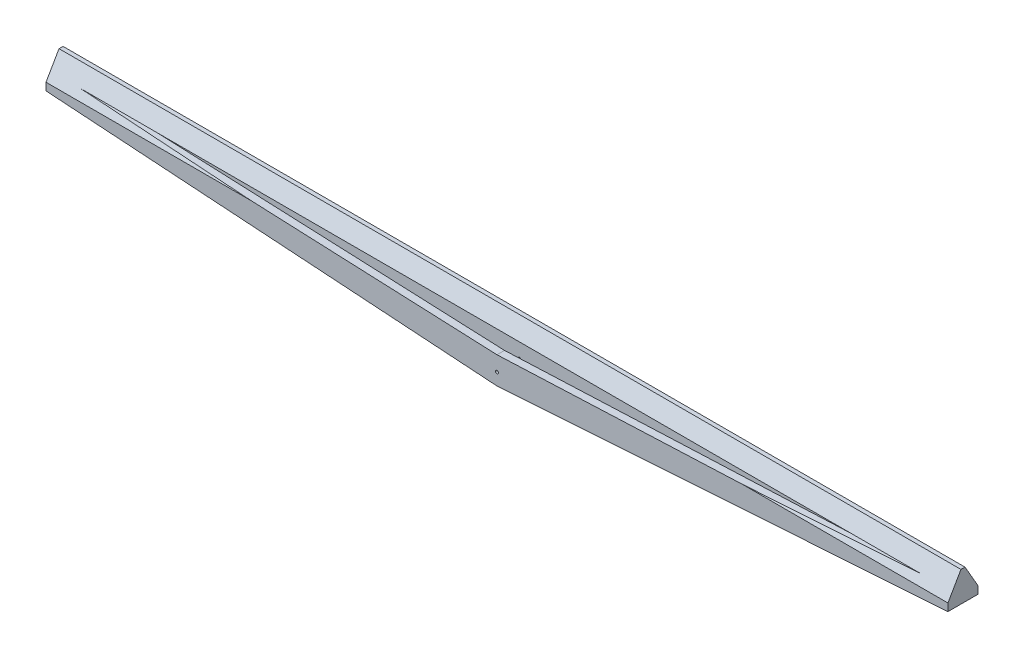
ISO-10303-21;
HEADER;
FILE_DESCRIPTION(('STEP AP214'),'2;1');
FILE_NAME('part.step','',(''),(''),'','','');
FILE_SCHEMA(('AUTOMOTIVE_DESIGN { 1 0 10303 214 1 1 1 1 }'));
ENDSEC;
DATA;
#1=APPLICATION_CONTEXT('core data for automotive mechanical design processes');
#2=APPLICATION_PROTOCOL_DEFINITION('international standard','automotive_design',2000,#1);
#3=PRODUCT_CONTEXT('',#1,'mechanical');
#4=PRODUCT('Part','Part','',(#3));
#5=PRODUCT_RELATED_PRODUCT_CATEGORY('part','',(#4));
#6=PRODUCT_DEFINITION_FORMATION('','',#4);
#7=PRODUCT_DEFINITION_CONTEXT('part definition',#1,'design');
#8=PRODUCT_DEFINITION('design','',#6,#7);
#9=PRODUCT_DEFINITION_SHAPE('','',#8);
#10=(LENGTH_UNIT() NAMED_UNIT(*) SI_UNIT(.MILLI.,.METRE.));
#11=(NAMED_UNIT(*) PLANE_ANGLE_UNIT() SI_UNIT($,.RADIAN.));
#12=(NAMED_UNIT(*) SI_UNIT($,.STERADIAN.) SOLID_ANGLE_UNIT());
#13=UNCERTAINTY_MEASURE_WITH_UNIT(LENGTH_MEASURE(1.E-05),#10,'distance_accuracy_value','');
#14=(GEOMETRIC_REPRESENTATION_CONTEXT(3) GLOBAL_UNCERTAINTY_ASSIGNED_CONTEXT((#13)) GLOBAL_UNIT_ASSIGNED_CONTEXT((#10,
#11,#12)) REPRESENTATION_CONTEXT('',''));
#15=CARTESIAN_POINT('',(0.,0.,0.));
#16=DIRECTION('',(0.,0.,1.));
#17=DIRECTION('',(1.,0.,0.));
#18=AXIS2_PLACEMENT_3D('',#15,#16,#17);
#19=CARTESIAN_POINT('',(300.,20.,20.));
#20=DIRECTION('',(-0.0665190105237739,0.997785157856609,0.));
#21=DIRECTION('',(-0.997785157856609,-0.0665190105237739,0.));
#22=AXIS2_PLACEMENT_3D('',#19,#20,#21);
#23=PLANE('',#22);
#24=DIRECTION('',(-0.997785157856609,-0.0665190105237739,0.));
#25=VECTOR('',#24,1.);
#26=CARTESIAN_POINT('',(300.,20.,15.));
#27=LINE('',#26,#25);
#28=CARTESIAN_POINT('',(250.,16.6666666666667,15.));
#29=VERTEX_POINT('',#28);
#30=CARTESIAN_POINT('',(0.,0.,15.));
#31=VERTEX_POINT('',#30);
#32=EDGE_CURVE('E175',#29,#31,#27,.T.);
#33=ORIENTED_EDGE('',*,*,#32,.F.);
#34=DIRECTION('',(0.,0.,1.));
#35=VECTOR('',#34,1.);
#36=CARTESIAN_POINT('',(250.,16.6666666666667,20.));
#37=LINE('',#36,#35);
#38=CARTESIAN_POINT('',(250.,16.6666666666667,5.00000000000001));
#39=VERTEX_POINT('',#38);
#40=EDGE_CURVE('E169',#39,#29,#37,.T.);
#41=ORIENTED_EDGE('',*,*,#40,.F.);
#42=DIRECTION('',(0.997785157856609,0.0665190105237739,0.));
#43=VECTOR('',#42,1.);
#44=CARTESIAN_POINT('',(300.,20.,5.00000000000001));
#45=LINE('',#44,#43);
#46=CARTESIAN_POINT('',(0.,0.,4.99999999999998));
#47=VERTEX_POINT('',#46);
#48=EDGE_CURVE('E157',#47,#39,#45,.T.);
#49=ORIENTED_EDGE('',*,*,#48,.F.);
#50=DIRECTION('',(0.,0.,-1.));
#51=VECTOR('',#50,1.);
#52=CARTESIAN_POINT('',(0.,0.,20.));
#53=LINE('',#52,#51);
#54=CARTESIAN_POINT('',(0.,0.,0.));
#55=VERTEX_POINT('',#54);
#56=EDGE_CURVE('E233',#47,#55,#53,.T.);
#57=ORIENTED_EDGE('',*,*,#56,.T.);
#58=DIRECTION('',(0.997785157856609,0.0665190105237739,0.));
#59=VECTOR('',#58,1.);
#60=CARTESIAN_POINT('',(300.,20.,0.));
#61=LINE('',#60,#59);
#62=CARTESIAN_POINT('',(300.,20.,0.));
#63=VERTEX_POINT('',#62);
#64=EDGE_CURVE('E212',#55,#63,#61,.T.);
#65=ORIENTED_EDGE('',*,*,#64,.T.);
#66=DIRECTION('',(0.,0.,-1.));
#67=VECTOR('',#66,1.);
#68=CARTESIAN_POINT('',(300.,20.,20.));
#69=LINE('',#68,#67);
#70=CARTESIAN_POINT('',(300.,20.,20.));
#71=VERTEX_POINT('',#70);
#72=EDGE_CURVE('E245',#71,#63,#69,.T.);
#73=ORIENTED_EDGE('',*,*,#72,.F.);
#74=DIRECTION('',(0.997785157856609,0.0665190105237739,0.));
#75=VECTOR('',#74,1.);
#76=CARTESIAN_POINT('',(300.,20.,20.));
#77=LINE('',#76,#75);
#78=CARTESIAN_POINT('',(0.,0.,20.));
#79=VERTEX_POINT('',#78);
#80=EDGE_CURVE('E223',#79,#71,#77,.T.);
#81=ORIENTED_EDGE('',*,*,#80,.F.);
#82=EDGE_CURVE('E234',#79,#31,#53,.T.);
#83=ORIENTED_EDGE('',*,*,#82,.T.);
#84=EDGE_LOOP('',(#33,#41,#49,#57,#65,#73,#81,#83));
#85=FACE_BOUND('',#84,.T.);
#86=ADVANCED_FACE('F33',(#85),#23,.F.);
#87=CARTESIAN_POINT('',(0.,0.,20.));
#88=DIRECTION('',(0.0665190105237739,0.997785157856609,0.));
#89=DIRECTION('',(-0.997785157856609,0.0665190105237739,0.));
#90=AXIS2_PLACEMENT_3D('',#87,#88,#89);
#91=PLANE('',#90);
#92=DIRECTION('',(-0.997785157856609,0.0665190105237739,0.));
#93=VECTOR('',#92,1.);
#94=CARTESIAN_POINT('',(0.,0.,15.));
#95=LINE('',#94,#93);
#96=CARTESIAN_POINT('',(-250.,16.6666666666667,14.9999999999999));
#97=VERTEX_POINT('',#96);
#98=EDGE_CURVE('E301',#31,#97,#95,.T.);
#99=ORIENTED_EDGE('',*,*,#98,.F.);
#100=ORIENTED_EDGE('',*,*,#82,.F.);
#101=DIRECTION('',(0.997785157856609,-0.0665190105237739,0.));
#102=VECTOR('',#101,1.);
#103=CARTESIAN_POINT('',(0.,0.,20.));
#104=LINE('',#103,#102);
#105=CARTESIAN_POINT('',(-300.,20.,20.));
#106=VERTEX_POINT('',#105);
#107=EDGE_CURVE('E231',#106,#79,#104,.T.);
#108=ORIENTED_EDGE('',*,*,#107,.F.);
#109=DIRECTION('',(0.,0.,-1.));
#110=VECTOR('',#109,1.);
#111=CARTESIAN_POINT('',(-300.,20.,20.));
#112=LINE('',#111,#110);
#113=CARTESIAN_POINT('',(-300.,20.,0.));
#114=VERTEX_POINT('',#113);
#115=EDGE_CURVE('E236',#106,#114,#112,.T.);
#116=ORIENTED_EDGE('',*,*,#115,.T.);
#117=DIRECTION('',(0.997785157856609,-0.0665190105237739,0.));
#118=VECTOR('',#117,1.);
#119=CARTESIAN_POINT('',(0.,0.,0.));
#120=LINE('',#119,#118);
#121=EDGE_CURVE('E220',#114,#55,#120,.T.);
#122=ORIENTED_EDGE('',*,*,#121,.T.);
#123=ORIENTED_EDGE('',*,*,#56,.F.);
#124=DIRECTION('',(0.997785157856609,-0.0665190105237739,0.));
#125=VECTOR('',#124,1.);
#126=CARTESIAN_POINT('',(0.,0.,4.99999999999998));
#127=LINE('',#126,#125);
#128=CARTESIAN_POINT('',(-250.,16.6666666666667,4.99999999999994));
#129=VERTEX_POINT('',#128);
#130=EDGE_CURVE('E163',#129,#47,#127,.T.);
#131=ORIENTED_EDGE('',*,*,#130,.F.);
#132=DIRECTION('',(0.,0.,-1.));
#133=VECTOR('',#132,1.);
#134=CARTESIAN_POINT('',(-250.,16.6666666666667,20.));
#135=LINE('',#134,#133);
#136=EDGE_CURVE('E179',#97,#129,#135,.T.);
#137=ORIENTED_EDGE('',*,*,#136,.F.);
#138=EDGE_LOOP('',(#99,#100,#108,#116,#122,#123,#131,#137));
#139=FACE_BOUND('',#138,.T.);
#140=ADVANCED_FACE('F307',(#139),#91,.F.);
#141=CARTESIAN_POINT('',(0.,18.,20.));
#142=DIRECTION('',(0.0428178383921859,0.99908289581767,0.));
#143=DIRECTION('',(-0.99908289581767,0.0428178383921859,0.));
#144=AXIS2_PLACEMENT_3D('',#141,#142,#143);
#145=PLANE('',#144);
#146=DIRECTION('',(0.,0.,-1.));
#147=VECTOR('',#146,1.);
#148=CARTESIAN_POINT('',(0.,18.,20.));
#149=LINE('',#148,#147);
#150=CARTESIAN_POINT('',(0.,18.,20.));
#151=VERTEX_POINT('',#150);
#152=CARTESIAN_POINT('',(0.,18.,15.));
#153=VERTEX_POINT('',#152);
#154=EDGE_CURVE('E209',#151,#153,#149,.T.);
#155=ORIENTED_EDGE('',*,*,#154,.T.);
#156=DIRECTION('',(-0.99908289581767,0.0428178383921859,0.));
#157=VECTOR('',#156,1.);
#158=CARTESIAN_POINT('',(0.,18.,15.));
#159=LINE('',#158,#157);
#160=CARTESIAN_POINT('',(-250.,28.7142857142857,14.9999999999999));
#161=VERTEX_POINT('',#160);
#162=EDGE_CURVE('E299',#153,#161,#159,.T.);
#163=ORIENTED_EDGE('',*,*,#162,.T.);
#164=DIRECTION('',(0.,0.,-1.));
#165=VECTOR('',#164,1.);
#166=CARTESIAN_POINT('',(-250.,28.7142857142857,20.));
#167=LINE('',#166,#165);
#168=CARTESIAN_POINT('',(-250.,28.7142857142857,4.99999999999994));
#169=VERTEX_POINT('',#168);
#170=EDGE_CURVE('E176',#161,#169,#167,.T.);
#171=ORIENTED_EDGE('',*,*,#170,.T.);
#172=DIRECTION('',(0.99908289581767,-0.0428178383921859,0.));
#173=VECTOR('',#172,1.);
#174=CARTESIAN_POINT('',(0.,18.,4.99999999999998));
#175=LINE('',#174,#173);
#176=CARTESIAN_POINT('',(0.,18.,4.99999999999998));
#177=VERTEX_POINT('',#176);
#178=EDGE_CURVE('E284',#169,#177,#175,.T.);
#179=ORIENTED_EDGE('',*,*,#178,.T.);
#180=CARTESIAN_POINT('',(0.,18.,0.));
#181=VERTEX_POINT('',#180);
#182=EDGE_CURVE('E208',#177,#181,#149,.T.);
#183=ORIENTED_EDGE('',*,*,#182,.T.);
#184=DIRECTION('',(0.99908289581767,-0.0428178383921859,0.));
#185=VECTOR('',#184,1.);
#186=CARTESIAN_POINT('',(0.,18.,0.));
#187=LINE('',#186,#185);
#188=CARTESIAN_POINT('',(-163.333333333332,24.9999999999999,0.));
#189=VERTEX_POINT('',#188);
#190=EDGE_CURVE('E191',#189,#181,#187,.T.);
#191=ORIENTED_EDGE('',*,*,#190,.F.);
#192=DIRECTION('',(-0.998777754686862,0.0428047609151512,0.0247133402369605));
#193=VECTOR('',#192,1.);
#194=CARTESIAN_POINT('',(-0.593418389779412,18.0254322167048,-4.02676858716678));
#195=LINE('',#194,#193);
#196=CARTESIAN_POINT('',(-280.,30.,2.8867513459482));
#197=VERTEX_POINT('',#196);
#198=EDGE_CURVE('E274',#189,#197,#195,.T.);
#199=ORIENTED_EDGE('',*,*,#198,.T.);
#200=DIRECTION('',(0.,0.,-1.));
#201=VECTOR('',#200,1.);
#202=CARTESIAN_POINT('',(-280.,30.,20.));
#203=LINE('',#202,#201);
#204=CARTESIAN_POINT('',(-280.,30.,17.1132486540518));
#205=VERTEX_POINT('',#204);
#206=EDGE_CURVE('E202',#205,#197,#203,.T.);
#207=ORIENTED_EDGE('',*,*,#206,.F.);
#208=DIRECTION('',(-0.998777754686862,0.0428047609151512,-0.0247133402369605));
#209=VECTOR('',#208,1.);
#210=CARTESIAN_POINT('',(-0.0997557003257349,18.0042752442997,24.0389835708801));
#211=LINE('',#210,#209);
#212=CARTESIAN_POINT('',(-163.333333333332,24.9999999999999,20.));
#213=VERTEX_POINT('',#212);
#214=EDGE_CURVE('E257',#205,#213,#211,.F.);
#215=ORIENTED_EDGE('',*,*,#214,.T.);
#216=DIRECTION('',(0.99908289581767,-0.0428178383921859,0.));
#217=VECTOR('',#216,1.);
#218=CARTESIAN_POINT('',(0.,18.,20.));
#219=LINE('',#218,#217);
#220=EDGE_CURVE('E197',#213,#151,#219,.T.);
#221=ORIENTED_EDGE('',*,*,#220,.T.);
#222=EDGE_LOOP('',(#155,#163,#171,#179,#183,#191,#199,#207,#215,#221));
#223=FACE_BOUND('',#222,.T.);
#224=ADVANCED_FACE('F343',(#223),#145,.T.);
#225=CARTESIAN_POINT('',(280.,30.,20.));
#226=DIRECTION('',(-0.0428178383921859,0.99908289581767,0.));
#227=DIRECTION('',(-0.99908289581767,-0.0428178383921859,0.));
#228=AXIS2_PLACEMENT_3D('',#225,#226,#227);
#229=PLANE('',#228);
#230=DIRECTION('',(0.,0.,1.));
#231=VECTOR('',#230,1.);
#232=CARTESIAN_POINT('',(250.,28.7142857142857,20.));
#233=LINE('',#232,#231);
#234=CARTESIAN_POINT('',(250.,28.7142857142857,5.00000000000001));
#235=VERTEX_POINT('',#234);
#236=CARTESIAN_POINT('',(250.,28.7142857142857,15.));
#237=VERTEX_POINT('',#236);
#238=EDGE_CURVE('E171',#235,#237,#233,.T.);
#239=ORIENTED_EDGE('',*,*,#238,.T.);
#240=DIRECTION('',(-0.99908289581767,-0.0428178383921859,0.));
#241=VECTOR('',#240,1.);
#242=CARTESIAN_POINT('',(280.,30.,15.));
#243=LINE('',#242,#241);
#244=EDGE_CURVE('E296',#237,#153,#243,.T.);
#245=ORIENTED_EDGE('',*,*,#244,.T.);
#246=ORIENTED_EDGE('',*,*,#154,.F.);
#247=DIRECTION('',(0.99908289581767,0.0428178383921859,0.));
#248=VECTOR('',#247,1.);
#249=CARTESIAN_POINT('',(280.,30.,20.));
#250=LINE('',#249,#248);
#251=CARTESIAN_POINT('',(163.333333333332,24.9999999999999,20.));
#252=VERTEX_POINT('',#251);
#253=EDGE_CURVE('E199',#151,#252,#250,.T.);
#254=ORIENTED_EDGE('',*,*,#253,.T.);
#255=DIRECTION('',(-0.998777754686862,-0.0428047609151512,0.0247133402369605));
#256=VECTOR('',#255,1.);
#257=CARTESIAN_POINT('',(279.928745928339,29.9969462540717,17.1150117350856));
#258=LINE('',#257,#256);
#259=CARTESIAN_POINT('',(280.,30.,17.1132486540518));
#260=VERTEX_POINT('',#259);
#261=EDGE_CURVE('E253',#252,#260,#258,.F.);
#262=ORIENTED_EDGE('',*,*,#261,.T.);
#263=DIRECTION('',(0.,0.,-1.));
#264=VECTOR('',#263,1.);
#265=CARTESIAN_POINT('',(280.,30.,20.));
#266=LINE('',#265,#264);
#267=CARTESIAN_POINT('',(280.,30.,2.8867513459482));
#268=VERTEX_POINT('',#267);
#269=EDGE_CURVE('E205',#260,#268,#266,.T.);
#270=ORIENTED_EDGE('',*,*,#269,.T.);
#271=DIRECTION('',(-0.998777754686862,-0.0428047609151512,-0.0247133402369605));
#272=VECTOR('',#271,1.);
#273=CARTESIAN_POINT('',(280.422408617792,30.0181032264768,2.8972032486278));
#274=LINE('',#273,#272);
#275=CARTESIAN_POINT('',(163.333333333333,25.,0.));
#276=VERTEX_POINT('',#275);
#277=EDGE_CURVE('E41',#268,#276,#274,.T.);
#278=ORIENTED_EDGE('',*,*,#277,.T.);
#279=DIRECTION('',(0.99908289581767,0.0428178383921859,0.));
#280=VECTOR('',#279,1.);
#281=CARTESIAN_POINT('',(280.,30.,0.));
#282=LINE('',#281,#280);
#283=EDGE_CURVE('E194',#181,#276,#282,.T.);
#284=ORIENTED_EDGE('',*,*,#283,.F.);
#285=ORIENTED_EDGE('',*,*,#182,.F.);
#286=DIRECTION('',(0.99908289581767,0.0428178383921859,0.));
#287=VECTOR('',#286,1.);
#288=CARTESIAN_POINT('',(280.,30.,5.00000000000001));
#289=LINE('',#288,#287);
#290=EDGE_CURVE('E280',#177,#235,#289,.T.);
#291=ORIENTED_EDGE('',*,*,#290,.T.);
#292=EDGE_LOOP('',(#239,#245,#246,#254,#262,#270,#278,#284,#285,#291));
#293=FACE_BOUND('',#292,.T.);
#294=ADVANCED_FACE('F340',(#293),#229,.T.);
#295=CARTESIAN_POINT('',(0.,8.,20.));
#296=DIRECTION('',(0.,0.,-1.));
#297=DIRECTION('',(-1.,0.,0.));
#298=AXIS2_PLACEMENT_3D('',#295,#296,#297);
#299=CYLINDRICAL_SURFACE('',#298,1.);
#300=CARTESIAN_POINT('',(0.,8.,20.));
#301=DIRECTION('',(0.,0.,1.));
#302=DIRECTION('',(1.,0.,0.));
#303=AXIS2_PLACEMENT_3D('',#300,#301,#302);
#304=CIRCLE('',#303,1.);
#305=CARTESIAN_POINT('',(1.,8.,20.));
#306=VERTEX_POINT('',#305);
#307=EDGE_CURVE('E188',#306,#306,#304,.T.);
#308=ORIENTED_EDGE('',*,*,#307,.T.);
#309=EDGE_LOOP('',(#308));
#310=FACE_BOUND('',#309,.T.);
#311=CARTESIAN_POINT('',(0.,8.,15.));
#312=DIRECTION('',(0.,0.,-1.));
#313=DIRECTION('',(-1.,0.,0.));
#314=AXIS2_PLACEMENT_3D('',#311,#312,#313);
#315=CIRCLE('',#314,1.);
#316=CARTESIAN_POINT('',(-1.,8.,15.));
#317=VERTEX_POINT('',#316);
#318=EDGE_CURVE('E36',#317,#317,#315,.T.);
#319=ORIENTED_EDGE('',*,*,#318,.T.);
#320=EDGE_LOOP('',(#319));
#321=FACE_BOUND('',#320,.T.);
#322=ADVANCED_FACE('F394',(#310,#321),#299,.F.);
#323=CARTESIAN_POINT('',(0.,8.,0.));
#324=DIRECTION('',(0.,0.,1.));
#325=DIRECTION('',(1.,0.,0.));
#326=AXIS2_PLACEMENT_3D('',#323,#324,#325);
#327=CIRCLE('',#326,1.);
#328=CARTESIAN_POINT('',(1.,8.,0.));
#329=VERTEX_POINT('',#328);
#330=EDGE_CURVE('E185',#329,#329,#327,.T.);
#331=ORIENTED_EDGE('',*,*,#330,.F.);
#332=EDGE_LOOP('',(#331));
#333=FACE_BOUND('',#332,.T.);
#334=CARTESIAN_POINT('',(0.,8.,4.99999999999998));
#335=DIRECTION('',(0.,0.,1.));
#336=DIRECTION('',(1.,0.,0.));
#337=AXIS2_PLACEMENT_3D('',#334,#335,#336);
#338=CIRCLE('',#337,1.);
#339=CARTESIAN_POINT('',(1.,8.,4.99999999999998));
#340=VERTEX_POINT('',#339);
#341=EDGE_CURVE('E278',#340,#340,#338,.T.);
#342=ORIENTED_EDGE('',*,*,#341,.T.);
#343=EDGE_LOOP('',(#342));
#344=FACE_BOUND('',#343,.T.);
#345=ADVANCED_FACE('F392',(#333,#344),#299,.F.);
#346=CARTESIAN_POINT('',(-300.,-20.,20.));
#347=DIRECTION('',(0.,0.,-1.));
#348=DIRECTION('',(-1.,0.,0.));
#349=AXIS2_PLACEMENT_3D('',#346,#347,#348);
#350=PLANE('',#349);
#351=DIRECTION('',(0.,1.,0.));
#352=VECTOR('',#351,1.);
#353=CARTESIAN_POINT('',(300.,40.,20.));
#354=LINE('',#353,#352);
#355=CARTESIAN_POINT('',(300.,24.9999999999999,20.));
#356=VERTEX_POINT('',#355);
#357=EDGE_CURVE('E226',#71,#356,#354,.T.);
#358=ORIENTED_EDGE('',*,*,#357,.T.);
#359=DIRECTION('',(-1.,0.,0.));
#360=VECTOR('',#359,1.);
#361=CARTESIAN_POINT('',(-300.,24.9999999999999,20.));
#362=LINE('',#361,#360);
#363=EDGE_CURVE('E250',#356,#252,#362,.T.);
#364=ORIENTED_EDGE('',*,*,#363,.T.);
#365=ORIENTED_EDGE('',*,*,#253,.F.);
#366=ORIENTED_EDGE('',*,*,#220,.F.);
#367=DIRECTION('',(-1.,0.,0.));
#368=VECTOR('',#367,1.);
#369=CARTESIAN_POINT('',(-300.,24.9999999999999,20.));
#370=LINE('',#369,#368);
#371=CARTESIAN_POINT('',(-300.,24.9999999999999,20.));
#372=VERTEX_POINT('',#371);
#373=EDGE_CURVE('E248',#213,#372,#370,.T.);
#374=ORIENTED_EDGE('',*,*,#373,.T.);
#375=DIRECTION('',(0.,-1.,0.));
#376=VECTOR('',#375,1.);
#377=CARTESIAN_POINT('',(-300.,20.,20.));
#378=LINE('',#377,#376);
#379=EDGE_CURVE('E229',#372,#106,#378,.T.);
#380=ORIENTED_EDGE('',*,*,#379,.T.);
#381=ORIENTED_EDGE('',*,*,#107,.T.);
#382=ORIENTED_EDGE('',*,*,#80,.T.);
#383=EDGE_LOOP('',(#358,#364,#365,#366,#374,#380,#381,#382));
#384=FACE_BOUND('',#383,.T.);
#385=ORIENTED_EDGE('',*,*,#307,.F.);
#386=EDGE_LOOP('',(#385));
#387=FACE_BOUND('',#386,.T.);
#388=ADVANCED_FACE('F312',(#384,#387),#350,.F.);
#389=CARTESIAN_POINT('',(-300.,-20.,0.));
#390=DIRECTION('',(0.,0.,-1.));
#391=DIRECTION('',(-1.,0.,0.));
#392=AXIS2_PLACEMENT_3D('',#389,#390,#391);
#393=PLANE('',#392);
#394=DIRECTION('',(0.,-1.,0.));
#395=VECTOR('',#394,1.);
#396=CARTESIAN_POINT('',(-300.,20.,0.));
#397=LINE('',#396,#395);
#398=CARTESIAN_POINT('',(-300.,24.9999999999999,0.));
#399=VERTEX_POINT('',#398);
#400=EDGE_CURVE('E218',#399,#114,#397,.T.);
#401=ORIENTED_EDGE('',*,*,#400,.F.);
#402=DIRECTION('',(1.,0.,0.));
#403=VECTOR('',#402,1.);
#404=CARTESIAN_POINT('',(300.,24.9999999999999,0.));
#405=LINE('',#404,#403);
#406=EDGE_CURVE('E272',#399,#189,#405,.T.);
#407=ORIENTED_EDGE('',*,*,#406,.T.);
#408=ORIENTED_EDGE('',*,*,#190,.T.);
#409=ORIENTED_EDGE('',*,*,#283,.T.);
#410=DIRECTION('',(1.,0.,0.));
#411=VECTOR('',#410,1.);
#412=CARTESIAN_POINT('',(300.,24.9999999999999,0.));
#413=LINE('',#412,#411);
#414=CARTESIAN_POINT('',(300.,24.9999999999999,0.));
#415=VERTEX_POINT('',#414);
#416=EDGE_CURVE('E270',#276,#415,#413,.T.);
#417=ORIENTED_EDGE('',*,*,#416,.T.);
#418=DIRECTION('',(0.,1.,0.));
#419=VECTOR('',#418,1.);
#420=CARTESIAN_POINT('',(300.,40.,0.));
#421=LINE('',#420,#419);
#422=EDGE_CURVE('E215',#63,#415,#421,.T.);
#423=ORIENTED_EDGE('',*,*,#422,.F.);
#424=ORIENTED_EDGE('',*,*,#64,.F.);
#425=ORIENTED_EDGE('',*,*,#121,.F.);
#426=EDGE_LOOP('',(#401,#407,#408,#409,#417,#423,#424,#425));
#427=FACE_BOUND('',#426,.T.);
#428=ORIENTED_EDGE('',*,*,#330,.T.);
#429=EDGE_LOOP('',(#428));
#430=FACE_BOUND('',#429,.T.);
#431=ADVANCED_FACE('F322',(#427,#430),#393,.T.);
#432=CARTESIAN_POINT('',(300.,40.,20.));
#433=DIRECTION('',(-1.,0.,0.));
#434=DIRECTION('',(0.,0.,1.));
#435=AXIS2_PLACEMENT_3D('',#432,#433,#434);
#436=PLANE('',#435);
#437=ORIENTED_EDGE('',*,*,#422,.T.);
#438=DIRECTION('',(0.,0.866025403784435,0.500000000000005));
#439=VECTOR('',#438,1.);
#440=CARTESIAN_POINT('',(300.,40.,8.66025403784455));
#441=LINE('',#440,#439);
#442=CARTESIAN_POINT('',(300.,40.,8.66025403784455));
#443=VERTEX_POINT('',#442);
#444=EDGE_CURVE('E11',#415,#443,#441,.T.);
#445=ORIENTED_EDGE('',*,*,#444,.T.);
#446=DIRECTION('',(0.,0.,-1.));
#447=VECTOR('',#446,1.);
#448=CARTESIAN_POINT('',(300.,40.,20.));
#449=LINE('',#448,#447);
#450=CARTESIAN_POINT('',(300.,40.,11.3397459621555));
#451=VERTEX_POINT('',#450);
#452=EDGE_CURVE('E242',#451,#443,#449,.T.);
#453=ORIENTED_EDGE('',*,*,#452,.F.);
#454=DIRECTION('',(0.,0.866025403784435,-0.500000000000005));
#455=VECTOR('',#454,1.);
#456=CARTESIAN_POINT('',(300.,24.9999999999999,20.));
#457=LINE('',#456,#455);
#458=EDGE_CURVE('E263',#451,#356,#457,.F.);
#459=ORIENTED_EDGE('',*,*,#458,.T.);
#460=ORIENTED_EDGE('',*,*,#357,.F.);
#461=ORIENTED_EDGE('',*,*,#72,.T.);
#462=EDGE_LOOP('',(#437,#445,#453,#459,#460,#461));
#463=FACE_BOUND('',#462,.T.);
#464=ADVANCED_FACE('F328',(#463),#436,.F.);
#465=CARTESIAN_POINT('',(-300.,40.,20.));
#466=DIRECTION('',(0.,-1.,0.));
#467=DIRECTION('',(0.,0.,-1.));
#468=AXIS2_PLACEMENT_3D('',#465,#466,#467);
#469=PLANE('',#468);
#470=ORIENTED_EDGE('',*,*,#452,.T.);
#471=DIRECTION('',(-1.,0.,0.));
#472=VECTOR('',#471,1.);
#473=CARTESIAN_POINT('',(-300.,40.,8.66025403784455));
#474=LINE('',#473,#472);
#475=CARTESIAN_POINT('',(-300.,40.,8.66025403784455));
#476=VERTEX_POINT('',#475);
#477=EDGE_CURVE('E265',#443,#476,#474,.T.);
#478=ORIENTED_EDGE('',*,*,#477,.T.);
#479=DIRECTION('',(0.,0.,-1.));
#480=VECTOR('',#479,1.);
#481=CARTESIAN_POINT('',(-300.,40.,20.));
#482=LINE('',#481,#480);
#483=CARTESIAN_POINT('',(-300.,40.,11.3397459621555));
#484=VERTEX_POINT('',#483);
#485=EDGE_CURVE('E239',#484,#476,#482,.T.);
#486=ORIENTED_EDGE('',*,*,#485,.F.);
#487=DIRECTION('',(1.,0.,0.));
#488=VECTOR('',#487,1.);
#489=CARTESIAN_POINT('',(-300.,40.,11.3397459621555));
#490=LINE('',#489,#488);
#491=EDGE_CURVE('E261',#484,#451,#490,.T.);
#492=ORIENTED_EDGE('',*,*,#491,.T.);
#493=EDGE_LOOP('',(#470,#478,#486,#492));
#494=FACE_BOUND('',#493,.T.);
#495=ADVANCED_FACE('F350',(#494),#469,.F.);
#496=CARTESIAN_POINT('',(-300.,20.,20.));
#497=DIRECTION('',(1.,0.,0.));
#498=DIRECTION('',(0.,0.,-1.));
#499=AXIS2_PLACEMENT_3D('',#496,#497,#498);
#500=PLANE('',#499);
#501=ORIENTED_EDGE('',*,*,#485,.T.);
#502=DIRECTION('',(0.,-0.866025403784435,-0.500000000000005));
#503=VECTOR('',#502,1.);
#504=CARTESIAN_POINT('',(-300.,40.,8.66025403784455));
#505=LINE('',#504,#503);
#506=EDGE_CURVE('E268',#476,#399,#505,.T.);
#507=ORIENTED_EDGE('',*,*,#506,.T.);
#508=ORIENTED_EDGE('',*,*,#400,.T.);
#509=ORIENTED_EDGE('',*,*,#115,.F.);
#510=ORIENTED_EDGE('',*,*,#379,.F.);
#511=DIRECTION('',(0.,-0.866025403784435,0.500000000000005));
#512=VECTOR('',#511,1.);
#513=CARTESIAN_POINT('',(-300.,24.9999999999999,20.));
#514=LINE('',#513,#512);
#515=EDGE_CURVE('E259',#372,#484,#514,.F.);
#516=ORIENTED_EDGE('',*,*,#515,.T.);
#517=EDGE_LOOP('',(#501,#507,#508,#509,#510,#516));
#518=FACE_BOUND('',#517,.T.);
#519=ADVANCED_FACE('F348',(#518),#500,.F.);
#520=CARTESIAN_POINT('',(-280.,30.,20.));
#521=DIRECTION('',(0.,-1.,0.));
#522=DIRECTION('',(0.,0.,-1.));
#523=AXIS2_PLACEMENT_3D('',#520,#521,#522);
#524=PLANE('',#523);
#525=ORIENTED_EDGE('',*,*,#206,.T.);
#526=DIRECTION('',(1.,0.,0.));
#527=VECTOR('',#526,1.);
#528=CARTESIAN_POINT('',(-280.,30.,2.8867513459482));
#529=LINE('',#528,#527);
#530=EDGE_CURVE('E276',#197,#268,#529,.T.);
#531=ORIENTED_EDGE('',*,*,#530,.T.);
#532=ORIENTED_EDGE('',*,*,#269,.F.);
#533=DIRECTION('',(1.,0.,0.));
#534=VECTOR('',#533,1.);
#535=CARTESIAN_POINT('',(-280.,30.,17.1132486540518));
#536=LINE('',#535,#534);
#537=EDGE_CURVE('E255',#260,#205,#536,.F.);
#538=ORIENTED_EDGE('',*,*,#537,.T.);
#539=EDGE_LOOP('',(#525,#531,#532,#538));
#540=FACE_BOUND('',#539,.T.);
#541=ADVANCED_FACE('F361',(#540),#524,.T.);
#542=CARTESIAN_POINT('',(-300.,24.9999999999999,20.));
#543=DIRECTION('',(0.,-0.500000000000005,-0.866025403784435));
#544=DIRECTION('',(0.,0.866025403784435,-0.500000000000005));
#545=AXIS2_PLACEMENT_3D('',#542,#543,#544);
#546=PLANE('',#545);
#547=ORIENTED_EDGE('',*,*,#458,.F.);
#548=ORIENTED_EDGE('',*,*,#491,.F.);
#549=ORIENTED_EDGE('',*,*,#515,.F.);
#550=ORIENTED_EDGE('',*,*,#373,.F.);
#551=ORIENTED_EDGE('',*,*,#214,.F.);
#552=ORIENTED_EDGE('',*,*,#537,.F.);
#553=ORIENTED_EDGE('',*,*,#261,.F.);
#554=ORIENTED_EDGE('',*,*,#363,.F.);
#555=EDGE_LOOP('',(#547,#548,#549,#550,#551,#552,#553,#554));
#556=FACE_BOUND('',#555,.T.);
#557=ADVANCED_FACE('F333',(#556),#546,.F.);
#558=CARTESIAN_POINT('',(-300.,40.,8.66025403784455));
#559=DIRECTION('',(0.,0.500000000000005,-0.866025403784435));
#560=DIRECTION('',(0.,0.866025403784435,0.500000000000005));
#561=AXIS2_PLACEMENT_3D('',#558,#559,#560);
#562=PLANE('',#561);
#563=ORIENTED_EDGE('',*,*,#198,.F.);
#564=ORIENTED_EDGE('',*,*,#406,.F.);
#565=ORIENTED_EDGE('',*,*,#506,.F.);
#566=ORIENTED_EDGE('',*,*,#477,.F.);
#567=ORIENTED_EDGE('',*,*,#444,.F.);
#568=ORIENTED_EDGE('',*,*,#416,.F.);
#569=ORIENTED_EDGE('',*,*,#277,.F.);
#570=ORIENTED_EDGE('',*,*,#530,.F.);
#571=EDGE_LOOP('',(#563,#564,#565,#566,#567,#568,#569,#570));
#572=FACE_BOUND('',#571,.T.);
#573=ADVANCED_FACE('F354',(#572),#562,.T.);
#574=CARTESIAN_POINT('',(-250.,-10.,4.99999999999994));
#575=DIRECTION('',(1.,0.,0.));
#576=DIRECTION('',(0.,0.,-1.));
#577=AXIS2_PLACEMENT_3D('',#574,#575,#576);
#578=PLANE('',#577);
#579=ORIENTED_EDGE('',*,*,#136,.T.);
#580=DIRECTION('',(0.,1.,0.));
#581=VECTOR('',#580,1.);
#582=CARTESIAN_POINT('',(-250.,-10.,4.99999999999994));
#583=LINE('',#582,#581);
#584=EDGE_CURVE('E49',#129,#169,#583,.T.);
#585=ORIENTED_EDGE('',*,*,#584,.T.);
#586=ORIENTED_EDGE('',*,*,#170,.F.);
#587=DIRECTION('',(0.,1.,0.));
#588=VECTOR('',#587,1.);
#589=CARTESIAN_POINT('',(-250.,-10.,14.9999999999999));
#590=LINE('',#589,#588);
#591=EDGE_CURVE('E281',#97,#161,#590,.T.);
#592=ORIENTED_EDGE('',*,*,#591,.F.);
#593=EDGE_LOOP('',(#579,#585,#586,#592));
#594=FACE_BOUND('',#593,.T.);
#595=ADVANCED_FACE('F407',(#594),#578,.T.);
#596=CARTESIAN_POINT('',(250.,-10.,15.));
#597=DIRECTION('',(-1.,0.,0.));
#598=DIRECTION('',(0.,0.,1.));
#599=AXIS2_PLACEMENT_3D('',#596,#597,#598);
#600=PLANE('',#599);
#601=ORIENTED_EDGE('',*,*,#40,.T.);
#602=DIRECTION('',(0.,1.,0.));
#603=VECTOR('',#602,1.);
#604=CARTESIAN_POINT('',(250.,-10.,15.));
#605=LINE('',#604,#603);
#606=EDGE_CURVE('E57',#29,#237,#605,.T.);
#607=ORIENTED_EDGE('',*,*,#606,.T.);
#608=ORIENTED_EDGE('',*,*,#238,.F.);
#609=DIRECTION('',(0.,1.,0.));
#610=VECTOR('',#609,1.);
#611=CARTESIAN_POINT('',(250.,-10.,5.00000000000001));
#612=LINE('',#611,#610);
#613=EDGE_CURVE('E160',#39,#235,#612,.T.);
#614=ORIENTED_EDGE('',*,*,#613,.F.);
#615=EDGE_LOOP('',(#601,#607,#608,#614));
#616=FACE_BOUND('',#615,.T.);
#617=ADVANCED_FACE('F168',(#616),#600,.T.);
#618=CARTESIAN_POINT('',(-250.,-10.,14.9999999999999));
#619=DIRECTION('',(0.,0.,-1.));
#620=DIRECTION('',(-1.,0.,0.));
#621=AXIS2_PLACEMENT_3D('',#618,#619,#620);
#622=PLANE('',#621);
#623=ORIENTED_EDGE('',*,*,#318,.F.);
#624=EDGE_LOOP('',(#623));
#625=FACE_BOUND('',#624,.T.);
#626=ORIENTED_EDGE('',*,*,#32,.T.);
#627=ORIENTED_EDGE('',*,*,#98,.T.);
#628=ORIENTED_EDGE('',*,*,#591,.T.);
#629=ORIENTED_EDGE('',*,*,#162,.F.);
#630=ORIENTED_EDGE('',*,*,#244,.F.);
#631=ORIENTED_EDGE('',*,*,#606,.F.);
#632=EDGE_LOOP('',(#626,#627,#628,#629,#630,#631));
#633=FACE_BOUND('',#632,.T.);
#634=ADVANCED_FACE('F303',(#625,#633),#622,.T.);
#635=CARTESIAN_POINT('',(250.,-10.,5.00000000000001));
#636=DIRECTION('',(0.,0.,1.));
#637=DIRECTION('',(1.,0.,0.));
#638=AXIS2_PLACEMENT_3D('',#635,#636,#637);
#639=PLANE('',#638);
#640=ORIENTED_EDGE('',*,*,#341,.F.);
#641=EDGE_LOOP('',(#640));
#642=FACE_BOUND('',#641,.T.);
#643=ORIENTED_EDGE('',*,*,#48,.T.);
#644=ORIENTED_EDGE('',*,*,#613,.T.);
#645=ORIENTED_EDGE('',*,*,#290,.F.);
#646=ORIENTED_EDGE('',*,*,#178,.F.);
#647=ORIENTED_EDGE('',*,*,#584,.F.);
#648=ORIENTED_EDGE('',*,*,#130,.T.);
#649=EDGE_LOOP('',(#643,#644,#645,#646,#647,#648));
#650=FACE_BOUND('',#649,.T.);
#651=ADVANCED_FACE('F159',(#642,#650),#639,.T.);
#652=CLOSED_SHELL('',(#86,#140,#224,#294,#322,#345,#388,#431,#464,#495,#519,#541,#557,#573,#595,
#617,#634,#651));
#653=MANIFOLD_SOLID_BREP('B2',#652);
#654=ADVANCED_BREP_SHAPE_REPRESENTATION('',(#18,#653),#14);
#655=SHAPE_DEFINITION_REPRESENTATION(#9,#654);
ENDSEC;
END-ISO-10303-21;
